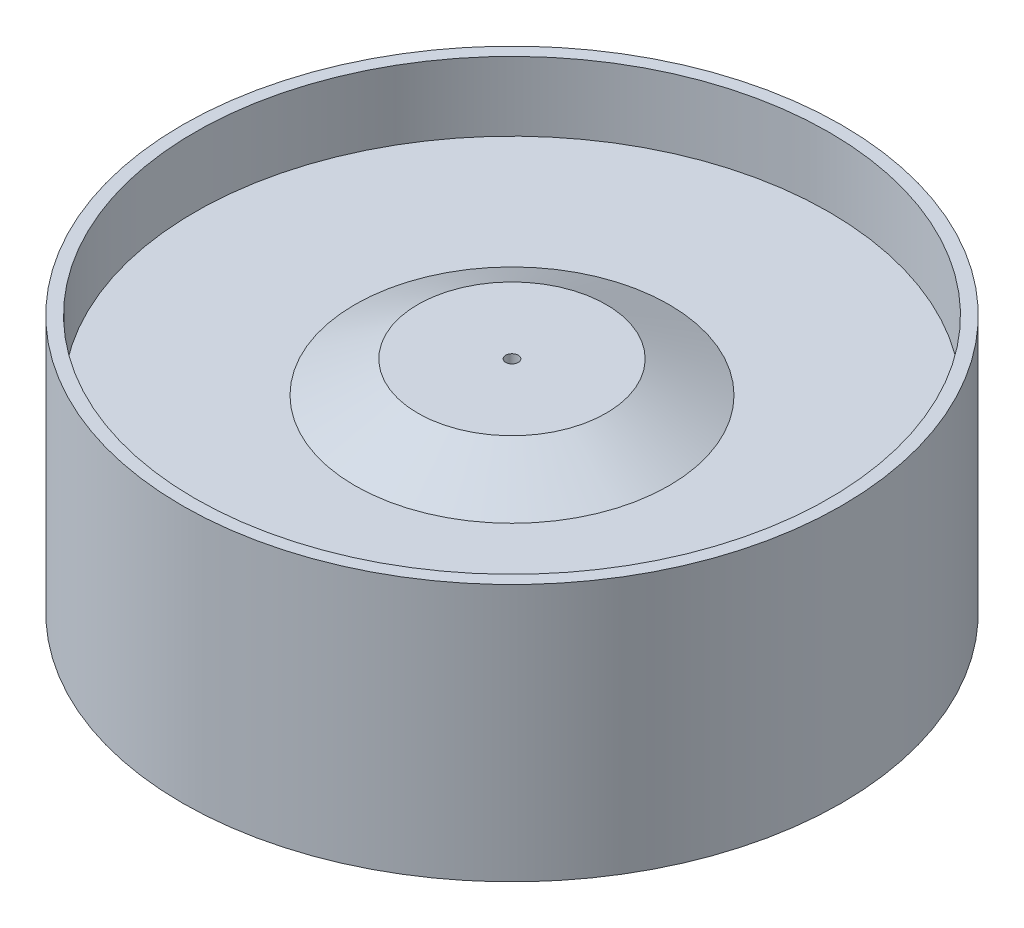
ISO-10303-21;
HEADER;
FILE_DESCRIPTION(('STEP AP214'),'2;1');
FILE_NAME('part.step','',(''),(''),'','','');
FILE_SCHEMA(('AUTOMOTIVE_DESIGN { 1 0 10303 214 1 1 1 1 }'));
ENDSEC;
DATA;
#1=APPLICATION_CONTEXT('core data for automotive mechanical design processes');
#2=APPLICATION_PROTOCOL_DEFINITION('international standard','automotive_design',2000,#1);
#3=PRODUCT_CONTEXT('',#1,'mechanical');
#4=PRODUCT('Part','Part','',(#3));
#5=PRODUCT_RELATED_PRODUCT_CATEGORY('part','',(#4));
#6=PRODUCT_DEFINITION_FORMATION('','',#4);
#7=PRODUCT_DEFINITION_CONTEXT('part definition',#1,'design');
#8=PRODUCT_DEFINITION('design','',#6,#7);
#9=PRODUCT_DEFINITION_SHAPE('','',#8);
#10=(LENGTH_UNIT() NAMED_UNIT(*) SI_UNIT(.MILLI.,.METRE.));
#11=(NAMED_UNIT(*) PLANE_ANGLE_UNIT() SI_UNIT($,.RADIAN.));
#12=(NAMED_UNIT(*) SI_UNIT($,.STERADIAN.) SOLID_ANGLE_UNIT());
#13=UNCERTAINTY_MEASURE_WITH_UNIT(LENGTH_MEASURE(1.E-05),#10,'distance_accuracy_value','');
#14=(GEOMETRIC_REPRESENTATION_CONTEXT(3) GLOBAL_UNCERTAINTY_ASSIGNED_CONTEXT((#13)) GLOBAL_UNIT_ASSIGNED_CONTEXT((#10,
#11,#12)) REPRESENTATION_CONTEXT('',''));
#15=CARTESIAN_POINT('',(0.,0.,0.));
#16=DIRECTION('',(0.,0.,1.));
#17=DIRECTION('',(1.,0.,0.));
#18=AXIS2_PLACEMENT_3D('',#15,#16,#17);
#19=CARTESIAN_POINT('',(0.,41.,0.));
#20=DIRECTION('',(0.,-1.,0.));
#21=DIRECTION('',(0.,0.,-1.));
#22=AXIS2_PLACEMENT_3D('',#19,#20,#21);
#23=CYLINDRICAL_SURFACE('',#22,50.5);
#24=CARTESIAN_POINT('',(0.,41.,0.));
#25=DIRECTION('',(0.,1.,0.));
#26=DIRECTION('',(0.,0.,1.));
#27=AXIS2_PLACEMENT_3D('',#24,#25,#26);
#28=CIRCLE('',#27,50.5);
#29=CARTESIAN_POINT('',(0.,41.,50.5));
#30=VERTEX_POINT('',#29);
#31=EDGE_CURVE('E55',#30,#30,#28,.T.);
#32=ORIENTED_EDGE('',*,*,#31,.T.);
#33=EDGE_LOOP('',(#32));
#34=FACE_BOUND('',#33,.T.);
#35=CARTESIAN_POINT('',(0.,30.,0.));
#36=DIRECTION('',(0.,-1.,0.));
#37=DIRECTION('',(0.,0.,-1.));
#38=AXIS2_PLACEMENT_3D('',#35,#36,#37);
#39=CIRCLE('',#38,50.5);
#40=CARTESIAN_POINT('',(0.,30.,-50.5));
#41=VERTEX_POINT('',#40);
#42=EDGE_CURVE('E61',#41,#41,#39,.T.);
#43=ORIENTED_EDGE('',*,*,#42,.T.);
#44=EDGE_LOOP('',(#43));
#45=FACE_BOUND('',#44,.T.);
#46=ADVANCED_FACE('F34',(#34,#45),#23,.F.);
#47=CARTESIAN_POINT('',(0.,41.,0.));
#48=DIRECTION('',(0.,1.,0.));
#49=DIRECTION('',(0.,0.,1.));
#50=AXIS2_PLACEMENT_3D('',#47,#48,#49);
#51=PLANE('',#50);
#52=CARTESIAN_POINT('',(0.,41.,0.));
#53=DIRECTION('',(0.,1.,0.));
#54=DIRECTION('',(0.,0.,1.));
#55=AXIS2_PLACEMENT_3D('',#52,#53,#54);
#56=CIRCLE('',#55,52.5);
#57=CARTESIAN_POINT('',(0.,41.,52.5));
#58=VERTEX_POINT('',#57);
#59=EDGE_CURVE('E49',#58,#58,#56,.T.);
#60=ORIENTED_EDGE('',*,*,#59,.T.);
#61=EDGE_LOOP('',(#60));
#62=FACE_BOUND('',#61,.T.);
#63=ORIENTED_EDGE('',*,*,#31,.F.);
#64=EDGE_LOOP('',(#63));
#65=FACE_BOUND('',#64,.T.);
#66=ADVANCED_FACE('F145',(#62,#65),#51,.T.);
#67=CARTESIAN_POINT('',(0.,0.,0.));
#68=DIRECTION('',(0.,1.,0.));
#69=DIRECTION('',(0.,0.,1.));
#70=AXIS2_PLACEMENT_3D('',#67,#68,#69);
#71=PLANE('',#70);
#72=CARTESIAN_POINT('',(0.,0.,0.));
#73=DIRECTION('',(0.,1.,0.));
#74=DIRECTION('',(0.,0.,1.));
#75=AXIS2_PLACEMENT_3D('',#72,#73,#74);
#76=CIRCLE('',#75,52.5);
#77=CARTESIAN_POINT('',(0.,0.,52.5));
#78=VERTEX_POINT('',#77);
#79=EDGE_CURVE('E52',#78,#78,#76,.T.);
#80=ORIENTED_EDGE('',*,*,#79,.F.);
#81=EDGE_LOOP('',(#80));
#82=FACE_BOUND('',#81,.T.);
#83=CARTESIAN_POINT('',(0.,0.,0.));
#84=DIRECTION('',(0.,1.,0.));
#85=DIRECTION('',(0.,0.,1.));
#86=AXIS2_PLACEMENT_3D('',#83,#84,#85);
#87=CIRCLE('',#86,50.5);
#88=CARTESIAN_POINT('',(0.,0.,50.5));
#89=VERTEX_POINT('',#88);
#90=EDGE_CURVE('E58',#89,#89,#87,.T.);
#91=ORIENTED_EDGE('',*,*,#90,.T.);
#92=EDGE_LOOP('',(#91));
#93=FACE_BOUND('',#92,.T.);
#94=ADVANCED_FACE('F152',(#82,#93),#71,.F.);
#95=CARTESIAN_POINT('',(0.,41.,0.));
#96=DIRECTION('',(0.,-1.,0.));
#97=DIRECTION('',(0.,0.,-1.));
#98=AXIS2_PLACEMENT_3D('',#95,#96,#97);
#99=CYLINDRICAL_SURFACE('',#98,52.5);
#100=ORIENTED_EDGE('',*,*,#59,.F.);
#101=EDGE_LOOP('',(#100));
#102=FACE_BOUND('',#101,.T.);
#103=ORIENTED_EDGE('',*,*,#79,.T.);
#104=EDGE_LOOP('',(#103));
#105=FACE_BOUND('',#104,.T.);
#106=ADVANCED_FACE('F36',(#102,#105),#99,.T.);
#107=CARTESIAN_POINT('',(0.,21.,0.));
#108=DIRECTION('',(0.,-1.,0.));
#109=DIRECTION('',(0.,0.,-1.));
#110=AXIS2_PLACEMENT_3D('',#107,#108,#109);
#111=CIRCLE('',#110,50.5);
#112=CARTESIAN_POINT('',(0.,21.,-50.5));
#113=VERTEX_POINT('',#112);
#114=EDGE_CURVE('E45',#113,#113,#111,.T.);
#115=ORIENTED_EDGE('',*,*,#114,.F.);
#116=EDGE_LOOP('',(#115));
#117=FACE_BOUND('',#116,.T.);
#118=ORIENTED_EDGE('',*,*,#90,.F.);
#119=EDGE_LOOP('',(#118));
#120=FACE_BOUND('',#119,.T.);
#121=ADVANCED_FACE('F148',(#117,#120),#23,.F.);
#122=CARTESIAN_POINT('',(0.,21.,0.));
#123=DIRECTION('',(0.,-1.,0.));
#124=DIRECTION('',(0.,0.,-1.));
#125=AXIS2_PLACEMENT_3D('',#122,#123,#124);
#126=PLANE('',#125);
#127=CARTESIAN_POINT('',(0.,21.,0.));
#128=DIRECTION('',(0.,-1.,0.));
#129=DIRECTION('',(0.,0.,-1.));
#130=AXIS2_PLACEMENT_3D('',#127,#128,#129);
#131=CIRCLE('',#130,33.);
#132=CARTESIAN_POINT('',(0.,21.,-33.));
#133=VERTEX_POINT('',#132);
#134=EDGE_CURVE('E111',#133,#133,#131,.T.);
#135=ORIENTED_EDGE('',*,*,#134,.F.);
#136=EDGE_LOOP('',(#135));
#137=FACE_BOUND('',#136,.T.);
#138=ORIENTED_EDGE('',*,*,#114,.T.);
#139=EDGE_LOOP('',(#138));
#140=FACE_BOUND('',#139,.T.);
#141=ADVANCED_FACE('F157',(#137,#140),#126,.T.);
#142=CARTESIAN_POINT('',(0.,30.,0.));
#143=DIRECTION('',(0.,-1.,0.));
#144=DIRECTION('',(0.,0.,-1.));
#145=AXIS2_PLACEMENT_3D('',#142,#143,#144);
#146=PLANE('',#145);
#147=CARTESIAN_POINT('',(0.,30.,0.));
#148=DIRECTION('',(0.,1.,0.));
#149=DIRECTION('',(0.,0.,1.));
#150=AXIS2_PLACEMENT_3D('',#147,#148,#149);
#151=CIRCLE('',#150,25.);
#152=CARTESIAN_POINT('',(0.,30.,25.));
#153=VERTEX_POINT('',#152);
#154=EDGE_CURVE('E66',#153,#153,#151,.T.);
#155=ORIENTED_EDGE('',*,*,#154,.F.);
#156=EDGE_LOOP('',(#155));
#157=FACE_BOUND('',#156,.T.);
#158=ORIENTED_EDGE('',*,*,#42,.F.);
#159=EDGE_LOOP('',(#158));
#160=FACE_BOUND('',#159,.T.);
#161=ADVANCED_FACE('F91',(#157,#160),#146,.F.);
#162=CARTESIAN_POINT('',(0.,35.,0.));
#163=DIRECTION('',(0.,1.,0.));
#164=DIRECTION('',(0.,0.,1.));
#165=AXIS2_PLACEMENT_3D('',#162,#163,#164);
#166=PLANE('',#165);
#167=CARTESIAN_POINT('',(0.,35.,0.));
#168=DIRECTION('',(0.,1.,0.));
#169=DIRECTION('',(0.,0.,1.));
#170=AXIS2_PLACEMENT_3D('',#167,#168,#169);
#171=CIRCLE('',#170,1.);
#172=CARTESIAN_POINT('',(0.,35.,1.));
#173=VERTEX_POINT('',#172);
#174=EDGE_CURVE('E122',#173,#173,#171,.T.);
#175=ORIENTED_EDGE('',*,*,#174,.F.);
#176=EDGE_LOOP('',(#175));
#177=FACE_BOUND('',#176,.T.);
#178=CARTESIAN_POINT('',(0.,35.,0.));
#179=DIRECTION('',(0.,1.,0.));
#180=DIRECTION('',(0.,0.,1.));
#181=AXIS2_PLACEMENT_3D('',#178,#179,#180);
#182=CIRCLE('',#181,15.);
#183=CARTESIAN_POINT('',(0.,35.,15.));
#184=VERTEX_POINT('',#183);
#185=EDGE_CURVE('E69',#184,#184,#182,.T.);
#186=ORIENTED_EDGE('',*,*,#185,.T.);
#187=EDGE_LOOP('',(#186));
#188=FACE_BOUND('',#187,.T.);
#189=ADVANCED_FACE('F80',(#177,#188),#166,.T.);
#190=CARTESIAN_POINT('',(0.,35.,0.));
#191=DIRECTION('',(0.,-1.,0.));
#192=DIRECTION('',(0.,0.,-1.));
#193=AXIS2_PLACEMENT_3D('',#190,#191,#192);
#194=CONICAL_SURFACE('',#193,15.,1.10714871779409);
#195=ORIENTED_EDGE('',*,*,#185,.F.);
#196=EDGE_LOOP('',(#195));
#197=FACE_BOUND('',#196,.T.);
#198=ORIENTED_EDGE('',*,*,#154,.T.);
#199=EDGE_LOOP('',(#198));
#200=FACE_BOUND('',#199,.T.);
#201=ADVANCED_FACE('F90',(#197,#200),#194,.T.);
#202=CARTESIAN_POINT('',(0.,11.,0.));
#203=DIRECTION('',(0.,-1.,0.));
#204=DIRECTION('',(0.,0.,-1.));
#205=AXIS2_PLACEMENT_3D('',#202,#203,#204);
#206=PLANE('',#205);
#207=CARTESIAN_POINT('',(0.,11.,0.));
#208=DIRECTION('',(0.,-1.,0.));
#209=DIRECTION('',(0.,0.,-1.));
#210=AXIS2_PLACEMENT_3D('',#207,#208,#209);
#211=CIRCLE('',#210,33.);
#212=CARTESIAN_POINT('',(0.,11.,-33.));
#213=VERTEX_POINT('',#212);
#214=EDGE_CURVE('E74',#213,#213,#211,.T.);
#215=ORIENTED_EDGE('',*,*,#214,.T.);
#216=EDGE_LOOP('',(#215));
#217=FACE_BOUND('',#216,.T.);
#218=CARTESIAN_POINT('',(0.,11.,0.));
#219=DIRECTION('',(0.,-1.,0.));
#220=DIRECTION('',(0.,0.,-1.));
#221=AXIS2_PLACEMENT_3D('',#218,#219,#220);
#222=CIRCLE('',#221,32.);
#223=CARTESIAN_POINT('',(0.,11.,-32.));
#224=VERTEX_POINT('',#223);
#225=EDGE_CURVE('E114',#224,#224,#222,.T.);
#226=ORIENTED_EDGE('',*,*,#225,.F.);
#227=EDGE_LOOP('',(#226));
#228=FACE_BOUND('',#227,.T.);
#229=ADVANCED_FACE('F98',(#217,#228),#206,.T.);
#230=CARTESIAN_POINT('',(0.,11.,0.));
#231=DIRECTION('',(0.,1.,0.));
#232=DIRECTION('',(0.,0.,1.));
#233=AXIS2_PLACEMENT_3D('',#230,#231,#232);
#234=CYLINDRICAL_SURFACE('',#233,33.);
#235=ORIENTED_EDGE('',*,*,#214,.F.);
#236=EDGE_LOOP('',(#235));
#237=FACE_BOUND('',#236,.T.);
#238=ORIENTED_EDGE('',*,*,#134,.T.);
#239=EDGE_LOOP('',(#238));
#240=FACE_BOUND('',#239,.T.);
#241=ADVANCED_FACE('F93',(#237,#240),#234,.T.);
#242=CARTESIAN_POINT('',(0.,11.,0.));
#243=DIRECTION('',(0.,1.,0.));
#244=DIRECTION('',(0.,0.,1.));
#245=AXIS2_PLACEMENT_3D('',#242,#243,#244);
#246=CYLINDRICAL_SURFACE('',#245,32.);
#247=CARTESIAN_POINT('',(0.,15.,0.));
#248=DIRECTION('',(0.,-1.,0.));
#249=DIRECTION('',(0.,0.,-1.));
#250=AXIS2_PLACEMENT_3D('',#247,#248,#249);
#251=CIRCLE('',#250,32.);
#252=CARTESIAN_POINT('',(0.,15.,-32.));
#253=VERTEX_POINT('',#252);
#254=EDGE_CURVE('E41',#253,#253,#251,.T.);
#255=ORIENTED_EDGE('',*,*,#254,.F.);
#256=EDGE_LOOP('',(#255));
#257=FACE_BOUND('',#256,.T.);
#258=ORIENTED_EDGE('',*,*,#225,.T.);
#259=EDGE_LOOP('',(#258));
#260=FACE_BOUND('',#259,.T.);
#261=ADVANCED_FACE('F227',(#257,#260),#246,.F.);
#262=CARTESIAN_POINT('',(0.,15.,0.));
#263=DIRECTION('',(0.,-1.,0.));
#264=DIRECTION('',(0.,0.,-1.));
#265=AXIS2_PLACEMENT_3D('',#262,#263,#264);
#266=PLANE('',#265);
#267=ORIENTED_EDGE('',*,*,#254,.T.);
#268=EDGE_LOOP('',(#267));
#269=FACE_BOUND('',#268,.T.);
#270=CARTESIAN_POINT('',(0.,15.,0.));
#271=DIRECTION('',(0.,-1.,0.));
#272=DIRECTION('',(0.,0.,-1.));
#273=AXIS2_PLACEMENT_3D('',#270,#271,#272);
#274=CIRCLE('',#273,25.);
#275=CARTESIAN_POINT('',(0.,15.,-25.));
#276=VERTEX_POINT('',#275);
#277=EDGE_CURVE('E119',#276,#276,#274,.T.);
#278=ORIENTED_EDGE('',*,*,#277,.F.);
#279=EDGE_LOOP('',(#278));
#280=FACE_BOUND('',#279,.T.);
#281=ADVANCED_FACE('F141',(#269,#280),#266,.T.);
#282=CARTESIAN_POINT('',(0.,15.,0.));
#283=DIRECTION('',(0.,1.,0.));
#284=DIRECTION('',(0.,0.,1.));
#285=AXIS2_PLACEMENT_3D('',#282,#283,#284);
#286=CYLINDRICAL_SURFACE('',#285,25.);
#287=CARTESIAN_POINT('',(0.,16.,0.));
#288=DIRECTION('',(0.,-1.,0.));
#289=DIRECTION('',(0.,0.,-1.));
#290=AXIS2_PLACEMENT_3D('',#287,#288,#289);
#291=CIRCLE('',#290,25.);
#292=CARTESIAN_POINT('',(0.,16.,-25.));
#293=VERTEX_POINT('',#292);
#294=EDGE_CURVE('E11',#293,#293,#291,.T.);
#295=ORIENTED_EDGE('',*,*,#294,.F.);
#296=EDGE_LOOP('',(#295));
#297=FACE_BOUND('',#296,.T.);
#298=ORIENTED_EDGE('',*,*,#277,.T.);
#299=EDGE_LOOP('',(#298));
#300=FACE_BOUND('',#299,.T.);
#301=ADVANCED_FACE('F133',(#297,#300),#286,.F.);
#302=CARTESIAN_POINT('',(0.,16.,0.));
#303=DIRECTION('',(0.,-1.,0.));
#304=DIRECTION('',(0.,0.,-1.));
#305=AXIS2_PLACEMENT_3D('',#302,#303,#304);
#306=PLANE('',#305);
#307=CARTESIAN_POINT('',(0.,16.,0.));
#308=DIRECTION('',(0.,-1.,0.));
#309=DIRECTION('',(0.,0.,-1.));
#310=AXIS2_PLACEMENT_3D('',#307,#308,#309);
#311=CIRCLE('',#310,1.);
#312=CARTESIAN_POINT('',(0.,16.,-1.));
#313=VERTEX_POINT('',#312);
#314=EDGE_CURVE('E125',#313,#313,#311,.T.);
#315=ORIENTED_EDGE('',*,*,#314,.F.);
#316=EDGE_LOOP('',(#315));
#317=FACE_BOUND('',#316,.T.);
#318=ORIENTED_EDGE('',*,*,#294,.T.);
#319=EDGE_LOOP('',(#318));
#320=FACE_BOUND('',#319,.T.);
#321=ADVANCED_FACE('F131',(#317,#320),#306,.T.);
#322=CARTESIAN_POINT('',(0.,105.,0.));
#323=DIRECTION('',(0.,-1.,0.));
#324=DIRECTION('',(0.,0.,-1.));
#325=AXIS2_PLACEMENT_3D('',#322,#323,#324);
#326=CYLINDRICAL_SURFACE('',#325,1.);
#327=ORIENTED_EDGE('',*,*,#174,.T.);
#328=EDGE_LOOP('',(#327));
#329=FACE_BOUND('',#328,.T.);
#330=ORIENTED_EDGE('',*,*,#314,.T.);
#331=EDGE_LOOP('',(#330));
#332=FACE_BOUND('',#331,.T.);
#333=ADVANCED_FACE('F129',(#329,#332),#326,.F.);
#334=CLOSED_SHELL('',(#46,#66,#94,#106,#121,#141,#161,#189,#201,#229,#241,#261,#281,#301,#321,#333));
#335=MANIFOLD_SOLID_BREP('B2',#334);
#336=ADVANCED_BREP_SHAPE_REPRESENTATION('',(#18,#335),#14);
#337=SHAPE_DEFINITION_REPRESENTATION(#9,#336);
ENDSEC;
END-ISO-10303-21;
